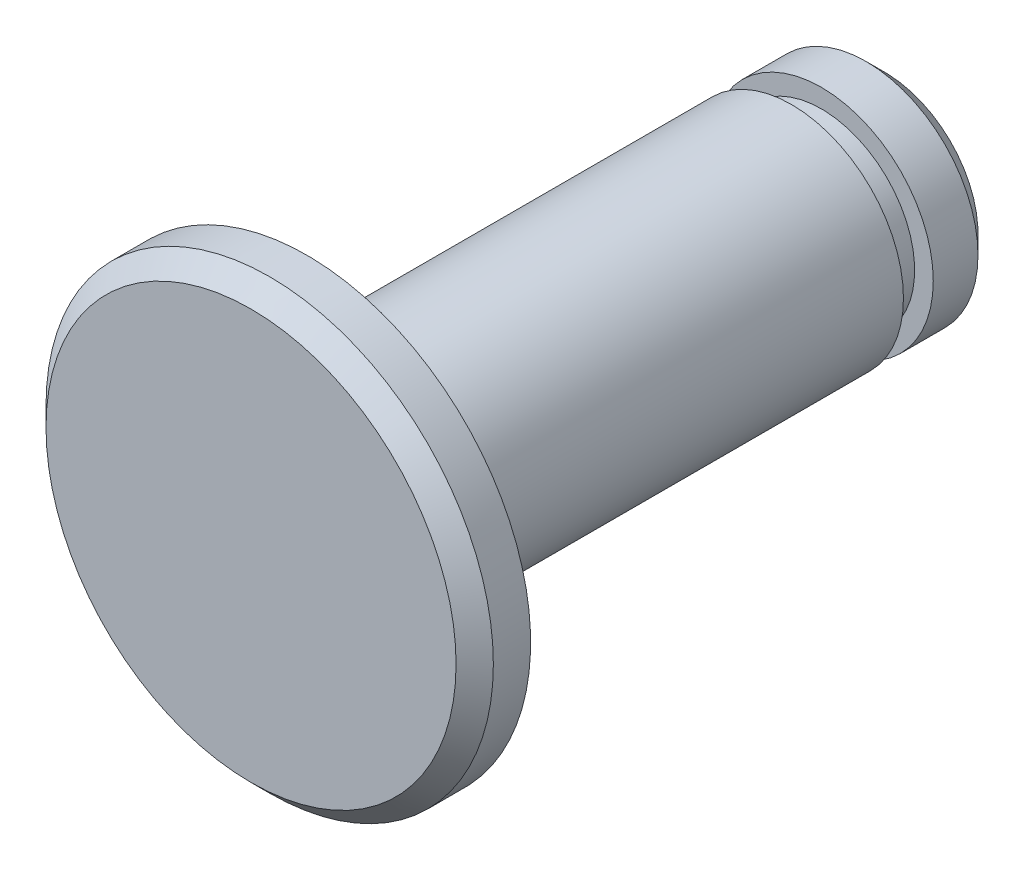
ISO-10303-21;
HEADER;
FILE_DESCRIPTION(('STEP AP214'),'2;1');
FILE_NAME('part.step','',(''),(''),'','','');
FILE_SCHEMA(('AUTOMOTIVE_DESIGN { 1 0 10303 214 1 1 1 1 }'));
ENDSEC;
DATA;
#1=APPLICATION_CONTEXT('core data for automotive mechanical design processes');
#2=APPLICATION_PROTOCOL_DEFINITION('international standard','automotive_design',2000,#1);
#3=PRODUCT_CONTEXT('',#1,'mechanical');
#4=PRODUCT('Part','Part','',(#3));
#5=PRODUCT_RELATED_PRODUCT_CATEGORY('part','',(#4));
#6=PRODUCT_DEFINITION_FORMATION('','',#4);
#7=PRODUCT_DEFINITION_CONTEXT('part definition',#1,'design');
#8=PRODUCT_DEFINITION('design','',#6,#7);
#9=PRODUCT_DEFINITION_SHAPE('','',#8);
#10=(LENGTH_UNIT() NAMED_UNIT(*) SI_UNIT(.MILLI.,.METRE.));
#11=(NAMED_UNIT(*) PLANE_ANGLE_UNIT() SI_UNIT($,.RADIAN.));
#12=(NAMED_UNIT(*) SI_UNIT($,.STERADIAN.) SOLID_ANGLE_UNIT());
#13=UNCERTAINTY_MEASURE_WITH_UNIT(LENGTH_MEASURE(1.E-05),#10,'distance_accuracy_value','');
#14=(GEOMETRIC_REPRESENTATION_CONTEXT(3) GLOBAL_UNCERTAINTY_ASSIGNED_CONTEXT((#13)) GLOBAL_UNIT_ASSIGNED_CONTEXT((#10,
#11,#12)) REPRESENTATION_CONTEXT('',''));
#15=CARTESIAN_POINT('',(0.,0.,0.));
#16=DIRECTION('',(0.,0.,1.));
#17=DIRECTION('',(1.,0.,0.));
#18=AXIS2_PLACEMENT_3D('',#15,#16,#17);
#19=CARTESIAN_POINT('',(0.,0.,22.3747126436782));
#20=DIRECTION('',(0.,0.,1.));
#21=DIRECTION('',(1.,0.,0.));
#22=AXIS2_PLACEMENT_3D('',#19,#20,#21);
#23=PLANE('',#22);
#24=CARTESIAN_POINT('',(0.,0.,22.3747126436782));
#25=DIRECTION('',(0.,0.,1.));
#26=DIRECTION('',(1.,0.,0.));
#27=AXIS2_PLACEMENT_3D('',#24,#25,#26);
#28=CIRCLE('',#27,5.49999999999999);
#29=CARTESIAN_POINT('',(5.5,0.,22.3747126436782));
#30=VERTEX_POINT('',#29);
#31=EDGE_CURVE('E10',#30,#30,#28,.T.);
#32=ORIENTED_EDGE('',*,*,#31,.T.);
#33=EDGE_LOOP('',(#32));
#34=FACE_BOUND('',#33,.T.);
#35=ADVANCED_FACE('F29',(#34),#23,.T.);
#36=CARTESIAN_POINT('',(0.,0.,-21.2761494252873));
#37=DIRECTION('',(0.,0.,-1.));
#38=DIRECTION('',(-1.,0.,0.));
#39=AXIS2_PLACEMENT_3D('',#36,#37,#38);
#40=CYLINDRICAL_SURFACE('',#39,6.);
#41=CARTESIAN_POINT('',(0.,0.,21.8747126436782));
#42=DIRECTION('',(0.,0.,1.));
#43=DIRECTION('',(1.,0.,0.));
#44=AXIS2_PLACEMENT_3D('',#41,#42,#43);
#45=CIRCLE('',#44,6.);
#46=CARTESIAN_POINT('',(6.,0.,21.8747126436782));
#47=VERTEX_POINT('',#46);
#48=EDGE_CURVE('E36',#47,#47,#45,.F.);
#49=ORIENTED_EDGE('',*,*,#48,.T.);
#50=EDGE_LOOP('',(#49));
#51=FACE_BOUND('',#50,.T.);
#52=CARTESIAN_POINT('',(0.,0.,20.8747126436782));
#53=DIRECTION('',(0.,0.,-1.));
#54=DIRECTION('',(-1.,0.,0.));
#55=AXIS2_PLACEMENT_3D('',#52,#53,#54);
#56=CIRCLE('',#55,6.);
#57=CARTESIAN_POINT('',(-5.99999999999999,0.,20.8747126436782));
#58=VERTEX_POINT('',#57);
#59=EDGE_CURVE('E49',#58,#58,#56,.T.);
#60=ORIENTED_EDGE('',*,*,#59,.F.);
#61=EDGE_LOOP('',(#60));
#62=FACE_BOUND('',#61,.T.);
#63=ADVANCED_FACE('F86',(#51,#62),#40,.T.);
#64=CARTESIAN_POINT('',(-5.99999999999999,0.,20.8747126436782));
#65=DIRECTION('',(0.,0.,-1.));
#66=DIRECTION('',(-1.,0.,0.));
#67=AXIS2_PLACEMENT_3D('',#64,#65,#66);
#68=PLANE('',#67);
#69=ORIENTED_EDGE('',*,*,#59,.T.);
#70=EDGE_LOOP('',(#69));
#71=FACE_BOUND('',#70,.T.);
#72=CARTESIAN_POINT('',(0.,0.,20.8747126436782));
#73=DIRECTION('',(0.,0.,-1.));
#74=DIRECTION('',(-1.,0.,0.));
#75=AXIS2_PLACEMENT_3D('',#72,#73,#74);
#76=CIRCLE('',#75,3.);
#77=CARTESIAN_POINT('',(-2.99999999999999,0.,20.8747126436782));
#78=VERTEX_POINT('',#77);
#79=EDGE_CURVE('E52',#78,#78,#76,.T.);
#80=ORIENTED_EDGE('',*,*,#79,.F.);
#81=EDGE_LOOP('',(#80));
#82=FACE_BOUND('',#81,.T.);
#83=ADVANCED_FACE('F91',(#71,#82),#68,.T.);
#84=CARTESIAN_POINT('',(0.,0.,-21.2761494252873));
#85=DIRECTION('',(0.,0.,-1.));
#86=DIRECTION('',(-1.,0.,0.));
#87=AXIS2_PLACEMENT_3D('',#84,#85,#86);
#88=CYLINDRICAL_SURFACE('',#87,3.);
#89=ORIENTED_EDGE('',*,*,#79,.T.);
#90=EDGE_LOOP('',(#89));
#91=FACE_BOUND('',#90,.T.);
#92=CARTESIAN_POINT('',(0.,0.,7.87471264367819));
#93=DIRECTION('',(0.,0.,-1.));
#94=DIRECTION('',(-1.,0.,0.));
#95=AXIS2_PLACEMENT_3D('',#92,#93,#94);
#96=CIRCLE('',#95,3.);
#97=CARTESIAN_POINT('',(-2.99999999999999,0.,7.87471264367819));
#98=VERTEX_POINT('',#97);
#99=EDGE_CURVE('E55',#98,#98,#96,.T.);
#100=ORIENTED_EDGE('',*,*,#99,.F.);
#101=EDGE_LOOP('',(#100));
#102=FACE_BOUND('',#101,.T.);
#103=ADVANCED_FACE('F144',(#91,#102),#88,.T.);
#104=CARTESIAN_POINT('',(-2.99999999999999,0.,7.87471264367819));
#105=DIRECTION('',(0.,0.,-1.));
#106=DIRECTION('',(-1.,0.,0.));
#107=AXIS2_PLACEMENT_3D('',#104,#105,#106);
#108=PLANE('',#107);
#109=ORIENTED_EDGE('',*,*,#99,.T.);
#110=EDGE_LOOP('',(#109));
#111=FACE_BOUND('',#110,.T.);
#112=CARTESIAN_POINT('',(0.,0.,7.87471264367819));
#113=DIRECTION('',(0.,0.,-1.));
#114=DIRECTION('',(-1.,0.,0.));
#115=AXIS2_PLACEMENT_3D('',#112,#113,#114);
#116=CIRCLE('',#115,2.5);
#117=CARTESIAN_POINT('',(-2.49999999999999,0.,7.87471264367819));
#118=VERTEX_POINT('',#117);
#119=EDGE_CURVE('E58',#118,#118,#116,.T.);
#120=ORIENTED_EDGE('',*,*,#119,.F.);
#121=EDGE_LOOP('',(#120));
#122=FACE_BOUND('',#121,.T.);
#123=ADVANCED_FACE('F82',(#111,#122),#108,.T.);
#124=CARTESIAN_POINT('',(0.,0.,-21.2761494252873));
#125=DIRECTION('',(0.,0.,-1.));
#126=DIRECTION('',(-1.,0.,0.));
#127=AXIS2_PLACEMENT_3D('',#124,#125,#126);
#128=CYLINDRICAL_SURFACE('',#127,2.5);
#129=ORIENTED_EDGE('',*,*,#119,.T.);
#130=EDGE_LOOP('',(#129));
#131=FACE_BOUND('',#130,.T.);
#132=CARTESIAN_POINT('',(0.,0.,7.07471264367818));
#133=DIRECTION('',(0.,0.,-1.));
#134=DIRECTION('',(-1.,0.,0.));
#135=AXIS2_PLACEMENT_3D('',#132,#133,#134);
#136=CIRCLE('',#135,2.5);
#137=CARTESIAN_POINT('',(-2.5,0.,7.07471264367818));
#138=VERTEX_POINT('',#137);
#139=EDGE_CURVE('E61',#138,#138,#136,.T.);
#140=ORIENTED_EDGE('',*,*,#139,.F.);
#141=EDGE_LOOP('',(#140));
#142=FACE_BOUND('',#141,.T.);
#143=ADVANCED_FACE('F72',(#131,#142),#128,.T.);
#144=CARTESIAN_POINT('',(-2.5,0.,7.07471264367818));
#145=DIRECTION('',(0.,0.,1.));
#146=DIRECTION('',(1.,0.,0.));
#147=AXIS2_PLACEMENT_3D('',#144,#145,#146);
#148=PLANE('',#147);
#149=ORIENTED_EDGE('',*,*,#139,.T.);
#150=EDGE_LOOP('',(#149));
#151=FACE_BOUND('',#150,.T.);
#152=CARTESIAN_POINT('',(0.,0.,7.07471264367818));
#153=DIRECTION('',(0.,0.,-1.));
#154=DIRECTION('',(-1.,0.,0.));
#155=AXIS2_PLACEMENT_3D('',#152,#153,#154);
#156=CIRCLE('',#155,3.);
#157=CARTESIAN_POINT('',(-3.,0.,7.07471264367818));
#158=VERTEX_POINT('',#157);
#159=EDGE_CURVE('E64',#158,#158,#156,.T.);
#160=ORIENTED_EDGE('',*,*,#159,.F.);
#161=EDGE_LOOP('',(#160));
#162=FACE_BOUND('',#161,.T.);
#163=ADVANCED_FACE('F70',(#151,#162),#148,.T.);
#164=CARTESIAN_POINT('',(0.,0.,-21.2761494252873));
#165=DIRECTION('',(0.,0.,-1.));
#166=DIRECTION('',(-1.,0.,0.));
#167=AXIS2_PLACEMENT_3D('',#164,#165,#166);
#168=CYLINDRICAL_SURFACE('',#167,3.);
#169=CARTESIAN_POINT('',(0.,0.,5.87471264367817));
#170=DIRECTION('',(0.,0.,-1.));
#171=DIRECTION('',(-1.,0.,0.));
#172=AXIS2_PLACEMENT_3D('',#169,#170,#171);
#173=CIRCLE('',#172,3.);
#174=CARTESIAN_POINT('',(-3.,0.,5.87471264367817));
#175=VERTEX_POINT('',#174);
#176=EDGE_CURVE('E40',#175,#175,#173,.F.);
#177=ORIENTED_EDGE('',*,*,#176,.T.);
#178=EDGE_LOOP('',(#177));
#179=FACE_BOUND('',#178,.T.);
#180=ORIENTED_EDGE('',*,*,#159,.T.);
#181=EDGE_LOOP('',(#180));
#182=FACE_BOUND('',#181,.T.);
#183=ADVANCED_FACE('F68',(#179,#182),#168,.T.);
#184=CARTESIAN_POINT('',(-3.,0.,5.37471264367818));
#185=DIRECTION('',(0.,0.,-1.));
#186=DIRECTION('',(-1.,0.,0.));
#187=AXIS2_PLACEMENT_3D('',#184,#185,#186);
#188=PLANE('',#187);
#189=CARTESIAN_POINT('',(0.,0.,5.37471264367818));
#190=DIRECTION('',(0.,0.,-1.));
#191=DIRECTION('',(-1.,0.,0.));
#192=AXIS2_PLACEMENT_3D('',#189,#190,#191);
#193=CIRCLE('',#192,2.5);
#194=CARTESIAN_POINT('',(-2.5,0.,5.37471264367818));
#195=VERTEX_POINT('',#194);
#196=EDGE_CURVE('E44',#195,#195,#193,.T.);
#197=ORIENTED_EDGE('',*,*,#196,.T.);
#198=EDGE_LOOP('',(#197));
#199=FACE_BOUND('',#198,.T.);
#200=ADVANCED_FACE('F79',(#199),#188,.T.);
#201=CARTESIAN_POINT('',(0.,0.,5.37471264367818));
#202=DIRECTION('',(0.,0.,1.));
#203=DIRECTION('',(1.,0.,0.));
#204=AXIS2_PLACEMENT_3D('',#201,#202,#203);
#205=CONICAL_SURFACE('',#204,2.50000000000001,0.785398163397451);
#206=ORIENTED_EDGE('',*,*,#176,.F.);
#207=EDGE_LOOP('',(#206));
#208=FACE_BOUND('',#207,.T.);
#209=ORIENTED_EDGE('',*,*,#196,.F.);
#210=EDGE_LOOP('',(#209));
#211=FACE_BOUND('',#210,.T.);
#212=ADVANCED_FACE('F94',(#208,#211),#205,.T.);
#213=CARTESIAN_POINT('',(0.,0.,21.8747126436782));
#214=DIRECTION('',(0.,0.,-1.));
#215=DIRECTION('',(-1.,0.,0.));
#216=AXIS2_PLACEMENT_3D('',#213,#214,#215);
#217=CONICAL_SURFACE('',#216,6.,0.785398163397449);
#218=ORIENTED_EDGE('',*,*,#31,.F.);
#219=EDGE_LOOP('',(#218));
#220=FACE_BOUND('',#219,.T.);
#221=ORIENTED_EDGE('',*,*,#48,.F.);
#222=EDGE_LOOP('',(#221));
#223=FACE_BOUND('',#222,.T.);
#224=ADVANCED_FACE('F31',(#220,#223),#217,.T.);
#225=CLOSED_SHELL('',(#35,#63,#83,#103,#123,#143,#163,#183,#200,#212,#224));
#226=MANIFOLD_SOLID_BREP('B2',#225);
#227=ADVANCED_BREP_SHAPE_REPRESENTATION('',(#18,#226),#14);
#228=SHAPE_DEFINITION_REPRESENTATION(#9,#227);
ENDSEC;
END-ISO-10303-21;
